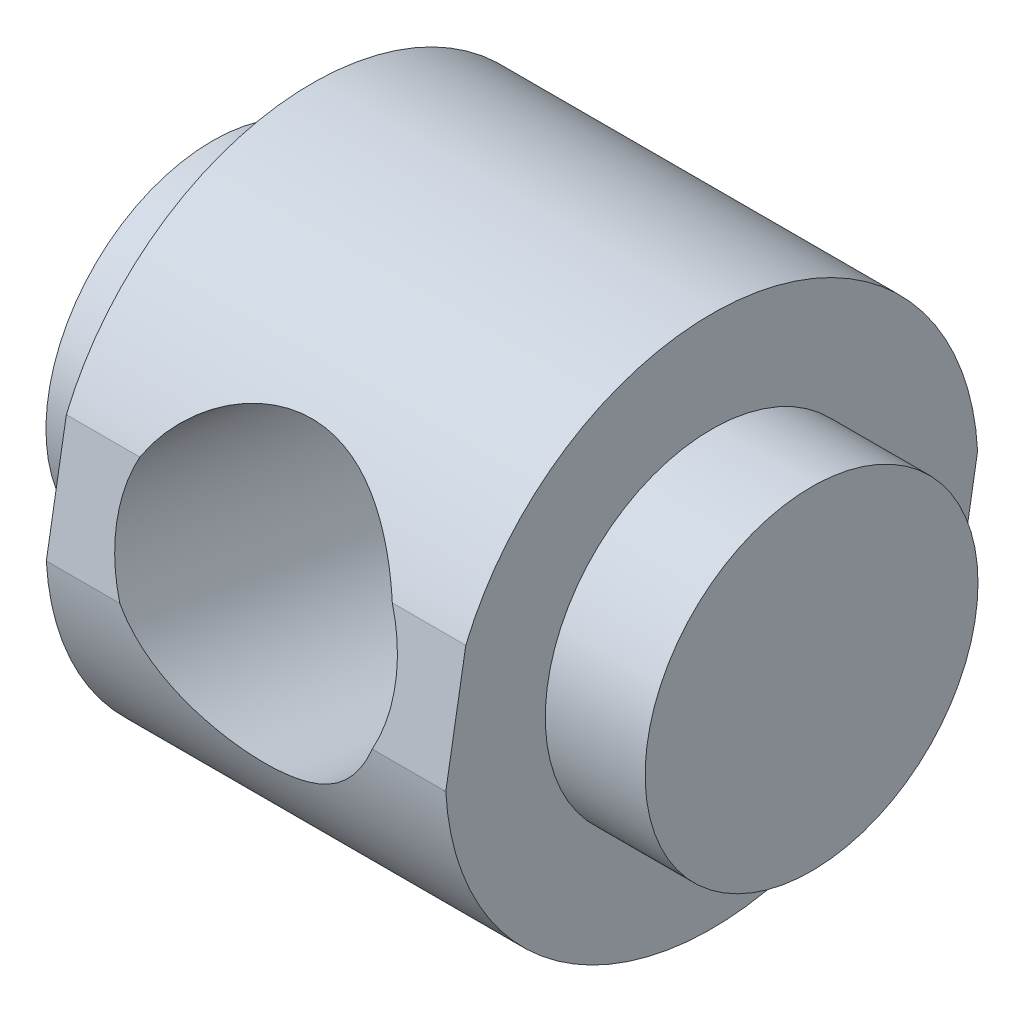
ISO-10303-21;
HEADER;
FILE_DESCRIPTION(('STEP AP214'),'2;1');
FILE_NAME('part.step','',(''),(''),'','','');
FILE_SCHEMA(('AUTOMOTIVE_DESIGN { 1 0 10303 214 1 1 1 1 }'));
ENDSEC;
DATA;
#1=APPLICATION_CONTEXT('core data for automotive mechanical design processes');
#2=APPLICATION_PROTOCOL_DEFINITION('international standard','automotive_design',2000,#1);
#3=PRODUCT_CONTEXT('',#1,'mechanical');
#4=PRODUCT('Part','Part','',(#3));
#5=PRODUCT_RELATED_PRODUCT_CATEGORY('part','',(#4));
#6=PRODUCT_DEFINITION_FORMATION('','',#4);
#7=PRODUCT_DEFINITION_CONTEXT('part definition',#1,'design');
#8=PRODUCT_DEFINITION('design','',#6,#7);
#9=PRODUCT_DEFINITION_SHAPE('','',#8);
#10=(LENGTH_UNIT() NAMED_UNIT(*) SI_UNIT(.MILLI.,.METRE.));
#11=(NAMED_UNIT(*) PLANE_ANGLE_UNIT() SI_UNIT($,.RADIAN.));
#12=(NAMED_UNIT(*) SI_UNIT($,.STERADIAN.) SOLID_ANGLE_UNIT());
#13=UNCERTAINTY_MEASURE_WITH_UNIT(LENGTH_MEASURE(1.E-05),#10,'distance_accuracy_value','');
#14=(GEOMETRIC_REPRESENTATION_CONTEXT(3) GLOBAL_UNCERTAINTY_ASSIGNED_CONTEXT((#13)) GLOBAL_UNIT_ASSIGNED_CONTEXT((#10,
#11,#12)) REPRESENTATION_CONTEXT('',''));
#15=CARTESIAN_POINT('',(0.,0.,0.));
#16=DIRECTION('',(0.,0.,1.));
#17=DIRECTION('',(1.,0.,0.));
#18=AXIS2_PLACEMENT_3D('',#15,#16,#17);
#19=CARTESIAN_POINT('',(9.5,28.9321861620804,8.96611499287433));
#20=DIRECTION('',(-1.,0.,0.));
#21=DIRECTION('',(0.,1.,0.));
#22=AXIS2_PLACEMENT_3D('',#19,#20,#21);
#23=PLANE('',#22);
#24=CARTESIAN_POINT('',(9.5,28.9321861620804,8.96611499287433));
#25=DIRECTION('',(-1.,0.,0.));
#26=DIRECTION('',(0.,-0.168953334472427,-0.985624051436778));
#27=AXIS2_PLACEMENT_3D('',#24,#25,#26);
#28=CIRCLE('',#27,5.);
#29=CARTESIAN_POINT('',(9.5,28.0874194897183,4.03799473569044));
#30=VERTEX_POINT('',#29);
#31=EDGE_CURVE('E11',#30,#30,#28,.T.);
#32=ORIENTED_EDGE('',*,*,#31,.T.);
#33=EDGE_LOOP('',(#32));
#34=FACE_BOUND('',#33,.T.);
#35=ADVANCED_FACE('F17',(#34),#23,.T.);
#36=CARTESIAN_POINT('',(27.5,28.9321861620804,8.96611499287432));
#37=DIRECTION('',(1.,0.,0.));
#38=DIRECTION('',(0.,0.,-1.));
#39=AXIS2_PLACEMENT_3D('',#36,#37,#38);
#40=PLANE('',#39);
#41=CARTESIAN_POINT('',(27.5,28.9321861620804,8.96611499287432));
#42=DIRECTION('',(1.,0.,0.));
#43=DIRECTION('',(0.,-0.985624051436778,0.168953334472427));
#44=AXIS2_PLACEMENT_3D('',#41,#42,#43);
#45=CIRCLE('',#44,5.);
#46=CARTESIAN_POINT('',(27.5,24.0040659048966,9.81088166523646));
#47=VERTEX_POINT('',#46);
#48=EDGE_CURVE('E25',#47,#47,#45,.T.);
#49=ORIENTED_EDGE('',*,*,#48,.T.);
#50=EDGE_LOOP('',(#49));
#51=FACE_BOUND('',#50,.T.);
#52=ADVANCED_FACE('F379',(#51),#40,.T.);
#53=CARTESIAN_POINT('',(12.5,28.9321861620804,8.96611499287433));
#54=DIRECTION('',(-1.,0.,0.));
#55=DIRECTION('',(0.,-0.168953334472427,-0.985624051436778));
#56=AXIS2_PLACEMENT_3D('',#53,#54,#55);
#57=CYLINDRICAL_SURFACE('',#56,5.);
#58=CARTESIAN_POINT('',(12.5,28.9321861620804,8.96611499287433));
#59=DIRECTION('',(-1.,0.,0.));
#60=DIRECTION('',(0.,-0.168953334472427,-0.985624051436778));
#61=AXIS2_PLACEMENT_3D('',#58,#59,#60);
#62=CIRCLE('',#61,5.);
#63=CARTESIAN_POINT('',(12.5,28.0874194897183,4.03799473569044));
#64=VERTEX_POINT('',#63);
#65=EDGE_CURVE('E168',#64,#64,#62,.T.);
#66=ORIENTED_EDGE('',*,*,#65,.T.);
#67=EDGE_LOOP('',(#66));
#68=FACE_BOUND('',#67,.T.);
#69=ORIENTED_EDGE('',*,*,#31,.F.);
#70=EDGE_LOOP('',(#69));
#71=FACE_BOUND('',#70,.T.);
#72=ADVANCED_FACE('F384',(#68,#71),#57,.T.);
#73=CARTESIAN_POINT('',(24.5,28.9321861620804,8.96611499287432));
#74=DIRECTION('',(1.,0.,0.));
#75=DIRECTION('',(0.,-0.985624051436778,0.168953334472427));
#76=AXIS2_PLACEMENT_3D('',#73,#74,#75);
#77=CYLINDRICAL_SURFACE('',#76,5.);
#78=ORIENTED_EDGE('',*,*,#48,.F.);
#79=EDGE_LOOP('',(#78));
#80=FACE_BOUND('',#79,.T.);
#81=CARTESIAN_POINT('',(24.5,28.9321861620804,8.96611499287432));
#82=DIRECTION('',(1.,0.,0.));
#83=DIRECTION('',(0.,-0.985624051436778,0.168953334472427));
#84=AXIS2_PLACEMENT_3D('',#81,#82,#83);
#85=CIRCLE('',#84,5.);
#86=CARTESIAN_POINT('',(24.5,24.0040659048966,9.81088166523646));
#87=VERTEX_POINT('',#86);
#88=EDGE_CURVE('E146',#87,#87,#85,.T.);
#89=ORIENTED_EDGE('',*,*,#88,.T.);
#90=EDGE_LOOP('',(#89));
#91=FACE_BOUND('',#90,.T.);
#92=ADVANCED_FACE('F389',(#80,#91),#77,.T.);
#93=CARTESIAN_POINT('',(29.5,32.475521573747,16.2724927710414));
#94=DIRECTION('',(0.,-0.168953334472427,-0.985624051436778));
#95=DIRECTION('',(0.,-0.985624051436778,0.168953334472427));
#96=AXIS2_PLACEMENT_3D('',#93,#94,#95);
#97=PLANE('',#96);
#98=DIRECTION('',(1.,0.,0.));
#99=VECTOR('',#98,1.);
#100=CARTESIAN_POINT('',(14.7078777016915,32.0021058092758,16.3536445772323));
#101=LINE('',#100,#99);
#102=CARTESIAN_POINT('',(12.5,32.0021058092758,16.3536445772323));
#103=VERTEX_POINT('',#102);
#104=CARTESIAN_POINT('',(14.7078777016899,32.0021058092753,16.3536445772324));
#105=VERTEX_POINT('',#104);
#106=EDGE_CURVE('E235',#103,#105,#101,.T.);
#107=ORIENTED_EDGE('',*,*,#106,.F.);
#108=DIRECTION('',(0.,0.985624051436778,-0.168953334472426));
#109=VECTOR('',#108,1.);
#110=CARTESIAN_POINT('',(12.5,32.0021058092758,16.3536445772323));
#111=LINE('',#110,#109);
#112=CARTESIAN_POINT('',(12.5,28.4979385326549,16.9543206109301));
#113=VERTEX_POINT('',#112);
#114=EDGE_CURVE('E166',#113,#103,#111,.T.);
#115=ORIENTED_EDGE('',*,*,#114,.F.);
#116=DIRECTION('',(-1.,0.,0.));
#117=VECTOR('',#116,1.);
#118=CARTESIAN_POINT('',(14.7078777016897,28.4979385326549,16.9543206109301));
#119=LINE('',#118,#117);
#120=CARTESIAN_POINT('',(14.7078777016915,28.4979385326549,16.9543206109301));
#121=VERTEX_POINT('',#120);
#122=EDGE_CURVE('E240',#121,#113,#119,.T.);
#123=ORIENTED_EDGE('',*,*,#122,.F.);
#124=CARTESIAN_POINT('',(18.5,30.2500221709654,16.6539825940812));
#125=DIRECTION('',(0.,0.168953334472427,0.985624051436778));
#126=DIRECTION('',(-1.,0.,0.));
#127=AXIS2_PLACEMENT_3D('',#124,#125,#126);
#128=CIRCLE('',#127,4.18810118375);
#129=CARTESIAN_POINT('',(14.31189881625,30.2500221709654,16.6539825940812));
#130=VERTEX_POINT('',#129);
#131=EDGE_CURVE('E179',#130,#121,#128,.T.);
#132=ORIENTED_EDGE('',*,*,#131,.F.);
#133=CARTESIAN_POINT('',(18.5,30.2500221709654,16.6539825940812));
#134=DIRECTION('',(0.,0.168953334472427,0.985624051436778));
#135=DIRECTION('',(-0.905451452085861,0.418347972371721,-0.0717122160309971));
#136=AXIS2_PLACEMENT_3D('',#133,#134,#135);
#137=CIRCLE('',#136,4.18810118375);
#138=EDGE_CURVE('E203',#105,#130,#137,.T.);
#139=ORIENTED_EDGE('',*,*,#138,.F.);
#140=EDGE_LOOP('',(#107,#115,#123,#132,#139));
#141=FACE_BOUND('',#140,.T.);
#142=ADVANCED_FACE('F358',(#141),#97,.F.);
#143=CARTESIAN_POINT('',(29.5,32.475521573747,16.2724927710414));
#144=DIRECTION('',(0.,-0.168953334472427,-0.985624051436778));
#145=DIRECTION('',(0.,-0.985624051436778,0.168953334472427));
#146=AXIS2_PLACEMENT_3D('',#143,#144,#145);
#147=PLANE('',#146);
#148=DIRECTION('',(1.,0.,0.));
#149=VECTOR('',#148,1.);
#150=CARTESIAN_POINT('',(24.5,32.0021058092758,16.3536445772323));
#151=LINE('',#150,#149);
#152=CARTESIAN_POINT('',(22.2921222983102,32.0021058092753,16.3536445772324));
#153=VERTEX_POINT('',#152);
#154=CARTESIAN_POINT('',(24.5,32.0021058092758,16.3536445772323));
#155=VERTEX_POINT('',#154);
#156=EDGE_CURVE('E123',#153,#155,#151,.T.);
#157=ORIENTED_EDGE('',*,*,#156,.F.);
#158=CARTESIAN_POINT('',(18.5,30.2500221709654,16.6539825940812));
#159=DIRECTION('',(0.,0.168953334472427,0.985624051436778));
#160=DIRECTION('',(0.905451452085523,-0.418347972372431,0.0717122160311186));
#161=AXIS2_PLACEMENT_3D('',#158,#159,#160);
#162=CIRCLE('',#161,4.18810118375);
#163=CARTESIAN_POINT('',(22.2921222983085,28.4979385326549,16.9543206109301));
#164=VERTEX_POINT('',#163);
#165=EDGE_CURVE('E178',#164,#153,#162,.T.);
#166=ORIENTED_EDGE('',*,*,#165,.F.);
#167=DIRECTION('',(-1.,0.,0.));
#168=VECTOR('',#167,1.);
#169=CARTESIAN_POINT('',(24.5,28.4979385326549,16.9543206109301));
#170=LINE('',#169,#168);
#171=CARTESIAN_POINT('',(24.5,28.4979385326549,16.9543206109301));
#172=VERTEX_POINT('',#171);
#173=EDGE_CURVE('E149',#172,#164,#170,.T.);
#174=ORIENTED_EDGE('',*,*,#173,.F.);
#175=DIRECTION('',(0.,-0.985624051436778,0.168953334472426));
#176=VECTOR('',#175,1.);
#177=CARTESIAN_POINT('',(24.5,32.0021058092758,16.3536445772323));
#178=LINE('',#177,#176);
#179=EDGE_CURVE('E142',#155,#172,#178,.T.);
#180=ORIENTED_EDGE('',*,*,#179,.F.);
#181=EDGE_LOOP('',(#157,#166,#174,#180));
#182=FACE_BOUND('',#181,.T.);
#183=ADVANCED_FACE('F148',(#182),#147,.F.);
#184=CARTESIAN_POINT('',(29.5,25.0141983364618,1.7239592418717));
#185=DIRECTION('',(0.,0.168953334472427,0.985624051436778));
#186=DIRECTION('',(1.,0.,0.));
#187=AXIS2_PLACEMENT_3D('',#184,#185,#186);
#188=PLANE('',#187);
#189=DIRECTION('',(1.,0.,0.));
#190=VECTOR('',#189,1.);
#191=CARTESIAN_POINT('',(14.7078777016915,25.862266514885,1.5785854085164));
#192=LINE('',#191,#190);
#193=CARTESIAN_POINT('',(12.5,25.862266514885,1.5785854085164));
#194=VERTEX_POINT('',#193);
#195=CARTESIAN_POINT('',(14.7078777016915,25.862266514885,1.5785854085164));
#196=VERTEX_POINT('',#195);
#197=EDGE_CURVE('E241',#194,#196,#192,.T.);
#198=ORIENTED_EDGE('',*,*,#197,.F.);
#199=DIRECTION('',(0.,-0.985624051436778,0.168953334472426));
#200=VECTOR('',#199,1.);
#201=CARTESIAN_POINT('',(12.5,25.862266514885,1.5785854085164));
#202=LINE('',#201,#200);
#203=CARTESIAN_POINT('',(12.5,29.366433791506,0.977909374818524));
#204=VERTEX_POINT('',#203);
#205=EDGE_CURVE('E161',#204,#194,#202,.T.);
#206=ORIENTED_EDGE('',*,*,#205,.F.);
#207=DIRECTION('',(-1.,0.,0.));
#208=VECTOR('',#207,1.);
#209=CARTESIAN_POINT('',(14.7078777016897,29.366433791506,0.977909374818519));
#210=LINE('',#209,#208);
#211=CARTESIAN_POINT('',(14.7078777016915,29.366433791506,0.977909374818525));
#212=VERTEX_POINT('',#211);
#213=EDGE_CURVE('E232',#212,#204,#210,.T.);
#214=ORIENTED_EDGE('',*,*,#213,.F.);
#215=CARTESIAN_POINT('',(18.5,27.6143501531955,1.27824739166746));
#216=DIRECTION('',(0.,-0.168953334472427,-0.985624051436778));
#217=DIRECTION('',(-0.905451452085743,0.418347972371969,-0.0717122160310395));
#218=AXIS2_PLACEMENT_3D('',#215,#216,#217);
#219=CIRCLE('',#218,4.18810118375);
#220=CARTESIAN_POINT('',(14.31189881625,27.6143501531955,1.27824739166746));
#221=VERTEX_POINT('',#220);
#222=EDGE_CURVE('E218',#221,#212,#219,.T.);
#223=ORIENTED_EDGE('',*,*,#222,.F.);
#224=CARTESIAN_POINT('',(18.5,27.6143501531955,1.27824739166746));
#225=DIRECTION('',(0.,-0.168953334472427,-0.985624051436778));
#226=DIRECTION('',(-1.,0.,0.));
#227=AXIS2_PLACEMENT_3D('',#224,#225,#226);
#228=CIRCLE('',#227,4.18810118375);
#229=EDGE_CURVE('E214',#196,#221,#228,.T.);
#230=ORIENTED_EDGE('',*,*,#229,.F.);
#231=EDGE_LOOP('',(#198,#206,#214,#223,#230));
#232=FACE_BOUND('',#231,.T.);
#233=ADVANCED_FACE('F351',(#232),#188,.F.);
#234=CARTESIAN_POINT('',(29.5,25.0141983364618,1.7239592418717));
#235=DIRECTION('',(0.,0.168953334472427,0.985624051436778));
#236=DIRECTION('',(1.,0.,0.));
#237=AXIS2_PLACEMENT_3D('',#234,#235,#236);
#238=PLANE('',#237);
#239=DIRECTION('',(1.,0.,0.));
#240=VECTOR('',#239,1.);
#241=CARTESIAN_POINT('',(24.5,25.862266514885,1.5785854085164));
#242=LINE('',#241,#240);
#243=CARTESIAN_POINT('',(22.2921222983085,25.8622665148851,1.57858540851639));
#244=VERTEX_POINT('',#243);
#245=CARTESIAN_POINT('',(24.5,25.862266514885,1.5785854085164));
#246=VERTEX_POINT('',#245);
#247=EDGE_CURVE('E244',#244,#246,#242,.T.);
#248=ORIENTED_EDGE('',*,*,#247,.F.);
#249=CARTESIAN_POINT('',(18.5,27.6143501531955,1.27824739166746));
#250=DIRECTION('',(0.,-0.168953334472427,-0.985624051436778));
#251=DIRECTION('',(0.905451452085743,-0.418347972371968,0.0717122160310392));
#252=AXIS2_PLACEMENT_3D('',#249,#250,#251);
#253=CIRCLE('',#252,4.18810118375);
#254=CARTESIAN_POINT('',(22.2921222983084,29.366433791506,0.977909374818522));
#255=VERTEX_POINT('',#254);
#256=EDGE_CURVE('E187',#255,#244,#253,.T.);
#257=ORIENTED_EDGE('',*,*,#256,.F.);
#258=DIRECTION('',(-1.,0.,0.));
#259=VECTOR('',#258,1.);
#260=CARTESIAN_POINT('',(24.5,29.366433791506,0.977909374818517));
#261=LINE('',#260,#259);
#262=CARTESIAN_POINT('',(24.5,29.366433791506,0.977909374818521));
#263=VERTEX_POINT('',#262);
#264=EDGE_CURVE('E135',#263,#255,#261,.T.);
#265=ORIENTED_EDGE('',*,*,#264,.F.);
#266=DIRECTION('',(0.,0.985624051436778,-0.168953334472426));
#267=VECTOR('',#266,1.);
#268=CARTESIAN_POINT('',(24.5,25.862266514885,1.57858540851639));
#269=LINE('',#268,#267);
#270=EDGE_CURVE('E144',#246,#263,#269,.T.);
#271=ORIENTED_EDGE('',*,*,#270,.F.);
#272=EDGE_LOOP('',(#248,#257,#265,#271));
#273=FACE_BOUND('',#272,.T.);
#274=ADVANCED_FACE('F366',(#273),#238,.F.);
#275=CARTESIAN_POINT('',(24.5,28.9321861620804,8.96611499287432));
#276=DIRECTION('',(-1.,0.,0.));
#277=DIRECTION('',(0.,-0.168953334472427,-0.985624051436778));
#278=AXIS2_PLACEMENT_3D('',#275,#276,#277);
#279=CYLINDRICAL_SURFACE('',#278,8.);
#280=ORIENTED_EDGE('',*,*,#173,.T.);
#281=CARTESIAN_POINT('',(22.292122298308,28.497938532654,16.9543206109303));
#282=CARTESIAN_POINT('',(22.2876123380333,28.488085585045,16.9537849954461));
#283=CARTESIAN_POINT('',(22.2771393895088,28.4654227697191,16.9525108887793));
#284=CARTESIAN_POINT('',(22.2590398116573,28.4270995589102,16.9501928893727));
#285=CARTESIAN_POINT('',(22.2316158854121,28.3705829974405,16.9464708979365));
#286=CARTESIAN_POINT('',(22.1891409486106,28.2865511162784,16.9402420261728));
#287=CARTESIAN_POINT('',(22.12154733313,28.1609012028978,16.9293040526781));
#288=CARTESIAN_POINT('',(22.0261985208725,27.9983671456936,16.9121376305382));
#289=CARTESIAN_POINT('',(21.9095004020778,27.8194278057749,16.8890611118427));
#290=CARTESIAN_POINT('',(21.7887926798963,27.6527540756867,16.8636563683043));
#291=CARTESIAN_POINT('',(21.6769171548586,27.511404558205,16.8392926598684));
#292=CARTESIAN_POINT('',(21.5749264013378,27.3917778449349,16.8166842271943));
#293=CARTESIAN_POINT('',(21.4787415764237,27.2862368990435,16.7951837141546));
#294=CARTESIAN_POINT('',(21.3829536873077,27.1873866850199,16.7737315635509));
#295=CARTESIAN_POINT('',(21.2834581254972,27.0907512277138,16.751516309219));
#296=CARTESIAN_POINT('',(21.1755165767504,26.9924504326604,16.7276153566872));
#297=CARTESIAN_POINT('',(21.0646677254679,26.8981814369252,16.7034176557624));
#298=CARTESIAN_POINT('',(20.9484479981239,26.8058177467989,16.67853427773));
#299=CARTESIAN_POINT('',(20.8089513826554,26.7024160587144,16.649388556647));
#300=CARTESIAN_POINT('',(20.6400255724902,26.5884873031557,16.6154643694124));
#301=CARTESIAN_POINT('',(20.444565327339,26.4714151263849,16.5785509615268));
#302=CARTESIAN_POINT('',(20.2626647558512,26.375466899239,16.5467437385581));
#303=CARTESIAN_POINT('',(20.0985901171304,26.2985682236625,16.5202926378776));
#304=CARTESIAN_POINT('',(19.9573730748517,26.2389325793304,16.4992108171571));
#305=CARTESIAN_POINT('',(19.8209255864497,26.1871356192335,16.4804721293177));
#306=CARTESIAN_POINT('',(19.6895672930377,26.1425036570194,16.4640031384101));
#307=CARTESIAN_POINT('',(19.5611857332768,26.1037302034302,16.4494514372464));
#308=CARTESIAN_POINT('',(19.4289308930178,26.0685247197209,16.4360463470439));
#309=CARTESIAN_POINT('',(19.2934987444319,26.0375476622598,16.4240903286885));
#310=CARTESIAN_POINT('',(19.1568110154099,26.0115280840516,16.4139303926631));
#311=CARTESIAN_POINT('',(19.0351437965676,25.9927042968815,16.4065141334428));
#312=CARTESIAN_POINT('',(18.925393631852,25.97905095221,16.4011025584242));
#313=CARTESIAN_POINT('',(18.8241582991481,25.9691319191447,16.3971538194209));
#314=CARTESIAN_POINT('',(18.721304173669,25.9618085254929,16.3942284881207));
#315=CARTESIAN_POINT('',(18.6130114377546,25.9570311058404,16.3923156588918));
#316=CARTESIAN_POINT('',(18.5389388969352,25.9559003421075,16.3918622763039));
#317=CARTESIAN_POINT('',(18.4561401700963,25.9559060355622,16.3918645583379));
#318=CARTESIAN_POINT('',(18.3492435540797,25.9577356797068,16.3925980948763));
#319=CARTESIAN_POINT('',(18.1798926189943,25.9676954818997,16.3965850434258));
#320=CARTESIAN_POINT('',(17.9925343136613,25.9879731361157,16.4046525486981));
#321=CARTESIAN_POINT('',(17.8237999763116,26.0145669721521,16.4151303396085));
#322=CARTESIAN_POINT('',(17.6739985107021,26.0446048709788,16.42682516347));
#323=CARTESIAN_POINT('',(17.5397014462844,26.0764136147137,16.4390667987327));
#324=CARTESIAN_POINT('',(17.4014628223846,26.1143389700928,16.4534639445781));
#325=CARTESIAN_POINT('',(17.2383466179114,26.1656944367825,16.4726343476549));
#326=CARTESIAN_POINT('',(17.0576891937398,26.2319175502951,16.496776107665));
#327=CARTESIAN_POINT('',(16.8675962957096,26.3131247436518,16.5254231300258));
#328=CARTESIAN_POINT('',(16.7105468199233,26.3895401480924,16.5514276716032));
#329=CARTESIAN_POINT('',(16.584719199962,26.4568271838868,16.5735957953058));
#330=CARTESIAN_POINT('',(16.4884128050973,26.5118164420669,16.5912620388429));
#331=CARTESIAN_POINT('',(16.3993520069663,26.5656774413934,16.6081479740157));
#332=CARTESIAN_POINT('',(16.3141536277989,26.6200096418263,16.6247674769886));
#333=CARTESIAN_POINT('',(16.229781854726,26.6766777341597,16.6416537840557));
#334=CARTESIAN_POINT('',(16.1364157752906,26.7426642147921,16.6607759940414));
#335=CARTESIAN_POINT('',(16.0345274228799,26.8190343077772,16.6821512827566));
#336=CARTESIAN_POINT('',(15.9247284773551,26.9069877637843,16.7057192636644));
#337=CARTESIAN_POINT('',(15.8254218816694,26.9919514783252,16.7274269422256));
#338=CARTESIAN_POINT('',(15.7363041250404,27.0727116576869,16.7471367446342));
#339=CARTESIAN_POINT('',(15.6568925044122,27.1483244111113,16.7648269964099));
#340=CARTESIAN_POINT('',(15.5788063880679,27.2264491393972,16.7822947212212));
#341=CARTESIAN_POINT('',(15.5020781969064,27.3071301222091,16.7994747048458));
#342=CARTESIAN_POINT('',(15.42701540604,27.3901081372243,16.8162389154887));
#343=CARTESIAN_POINT('',(15.3538106388085,27.4752096779451,16.8324847848789));
#344=CARTESIAN_POINT('',(15.2826833881522,27.562192390296,16.8481052225261));
#345=CARTESIAN_POINT('',(15.2137999698915,27.6508467961205,16.8630072347612));
#346=CARTESIAN_POINT('',(15.1472688721305,27.7410056481816,16.8771137556019));
#347=CARTESIAN_POINT('',(15.0832763075178,27.8323674096059,16.8903355624785));
#348=CARTESIAN_POINT('',(15.0218543278782,27.9248144579411,16.9026207912262));
#349=CARTESIAN_POINT('',(14.963117877779,28.0180846502237,16.9139061017882));
#350=CARTESIAN_POINT('',(14.906953606543,28.1122660500268,16.9241764972224));
#351=CARTESIAN_POINT('',(14.853371049209,28.2072656361966,16.9333952316278));
#352=CARTESIAN_POINT('',(14.8022509023834,28.3032368004548,16.9415484294637));
#353=CARTESIAN_POINT('',(14.7536575365269,28.4000098931356,16.9485928222075));
#354=CARTESIAN_POINT('',(14.7228473952259,28.4652341985173,16.9525428630035));
#355=CARTESIAN_POINT('',(14.7078777016915,28.4979385326549,16.9543206109301));
#356=(BOUNDED_CURVE() B_SPLINE_CURVE(3,(#281,#282,#283,#284,#285,#286,#287,#288,#289,#290,#291,
#292,#293,#294,#295,#296,#297,#298,#299,#300,#301,#302,#303,#304,#305,#306,#307,#308,#309,#310,
#311,#312,#313,#314,#315,#316,#317,#318,#319,#320,#321,#322,#323,#324,#325,#326,#327,#328,#329,
#330,#331,#332,#333,#334,#335,#336,#337,#338,#339,#340,#341,#342,#343,#344,#345,#346,#347,#348,
#349,#350,#351,#352,#353,#354,#355),.UNSPECIFIED.,.F.,.F.) B_SPLINE_CURVE_WITH_KNOTS((4,1,1,1,1,
1,1,1,1,1,1,1,1,1,1,1,1,1,1,1,1,1,1,1,1,1,1,1,1,1,1,1,1,1,1,1,1,1,1,1,1,1,1,1,1,1,1,1,1,1,1,1,1,
1,1,1,1,1,1,1,1,1,1,1,1,1,1,1,1,1,1,1,4),(-1.,-0.996651289687855,-0.992283938378942,
-0.986897693443876,-0.97722492417873,-0.963152721102108,-0.942721727736752,-0.918819593456926,
-0.896831367431257,-0.878710267159151,-0.862661023267596,-0.847799575195839,-0.834128741396208,
-0.819651488285885,-0.804432371541542,-0.78845611707767,-0.77411179030148,-0.75796155320728,
-0.734099486660581,-0.710352749677999,-0.686715882226512,-0.669871689432698,-0.653824547362671,
-0.638948332384977,-0.624443266152868,-0.610690972378039,-0.597301005784033,-0.581993215158953,
-0.567650793720344,-0.554238856664895,-0.543919470644097,-0.533464920510984,-0.522809578604237,
-0.512070678277628,-0.49999412847409,-0.499939719596079,-0.486507088771083,-0.466991057737586,
-0.447571385397513,-0.428297798309624,-0.414167939356267,-0.400264869105048,-0.385522119551643,
-0.369694284272437,-0.347150976524436,-0.325676706671645,-0.305273269566202,-0.292644261926177,
-0.281098042946922,-0.270605159753166,-0.260090976066556,-0.249478802162158,-0.238791956252602,
-0.224297615040081,-0.209614115473087,-0.194752911749389,-0.183397872796119,-0.171990104830281,
-0.160464604624944,-0.148874832574196,-0.137210913598943,-0.125534866260565,-0.113855278671755,
-0.102183377177187,-0.0905623939711749,-0.0789793106065319,-0.0674934681499495,
-0.0560741293064908,-0.0447605074266884,-0.0334827710903645,-0.0222789134646092,
-0.0111027051913207,0.),
.UNSPECIFIED.) CURVE() GEOMETRIC_REPRESENTATION_ITEM() RATIONAL_B_SPLINE_CURVE((1.,1.,1.,1.,1.,
1.,1.,1.,1.,1.,1.,1.,1.,1.,1.,1.,1.,1.,1.,1.,1.,1.,1.,1.,1.,1.,1.,1.,1.,1.,1.,1.,1.,1.,1.,1.,1.,
1.,1.,1.,1.,1.,1.,1.,1.,1.,1.,1.,1.,1.,1.,1.,1.,1.,1.,1.,1.,1.,1.,1.,1.,1.,1.,1.,1.,1.,1.,1.,1.,
1.,1.,1.,1.,1.,1.)) REPRESENTATION_ITEM(''));
#357=EDGE_CURVE('E172',#164,#121,#356,.T.);
#358=ORIENTED_EDGE('',*,*,#357,.T.);
#359=ORIENTED_EDGE('',*,*,#122,.T.);
#360=CARTESIAN_POINT('',(12.5,28.9321861620804,8.96611499287433));
#361=DIRECTION('',(-1.,0.,0.));
#362=DIRECTION('',(0.,-0.383739955899426,-0.923441198044741));
#363=AXIS2_PLACEMENT_3D('',#360,#361,#362);
#364=CIRCLE('',#363,8.);
#365=EDGE_CURVE('E171',#194,#113,#364,.T.);
#366=ORIENTED_EDGE('',*,*,#365,.F.);
#367=ORIENTED_EDGE('',*,*,#197,.T.);
#368=CARTESIAN_POINT('',(14.7078777016915,25.862266514885,1.5785854085164));
#369=CARTESIAN_POINT('',(14.7123876560201,25.8531544747859,1.58237195422786));
#370=CARTESIAN_POINT('',(14.7228605935104,25.8322098516803,1.59112113901702));
#371=CARTESIAN_POINT('',(14.7409601493182,25.7968465793847,1.60607028957643));
#372=CARTESIAN_POINT('',(14.7683840037184,25.7447963128792,1.62840251407588));
#373=CARTESIAN_POINT('',(14.8108587444068,25.6676367035698,1.66226235214321));
#374=CARTESIAN_POINT('',(14.8748289869357,25.5589587566733,1.71162734840627));
#375=CARTESIAN_POINT('',(14.958400481732,25.4288262607991,1.77344461231986));
#376=CARTESIAN_POINT('',(15.0532013331392,25.2948558599737,1.84030426360926));
#377=CARTESIAN_POINT('',(15.14954088451,25.1706402099788,1.90519970023852));
#378=CARTESIAN_POINT('',(15.2489532134183,25.0524235609935,1.96945150726045));
#379=CARTESIAN_POINT('',(15.3550198152673,24.9362068775399,2.03513551215372));
#380=CARTESIAN_POINT('',(15.4711541310432,24.8195016511895,2.10377451041595));
#381=CARTESIAN_POINT('',(15.5801858198995,24.7189084495521,2.1652102602392));
#382=CARTESIAN_POINT('',(15.6788789905051,24.6342341639537,2.21851882939145));
#383=CARTESIAN_POINT('',(15.7649689590891,24.5645768714481,2.26342106736298));
#384=CARTESIAN_POINT('',(15.8512780568904,24.4985653840359,2.30690985340866));
#385=CARTESIAN_POINT('',(15.9448438189455,24.4309542498433,2.35239923971631));
#386=CARTESIAN_POINT('',(16.051537277852,24.3586095435693,2.40217934990299));
#387=CARTESIAN_POINT('',(16.1910387115443,24.2708143559006,2.46410141635706));
#388=CARTESIAN_POINT('',(16.359968554799,24.1746854831553,2.53403462978775));
#389=CARTESIAN_POINT('',(16.5554330007346,24.0765886721158,2.60783310153137));
#390=CARTESIAN_POINT('',(16.7373351386019,23.9967108457685,2.66978042624837));
#391=CARTESIAN_POINT('',(16.9014098275488,23.9330118458116,2.72033245682771));
#392=CARTESIAN_POINT('',(17.0426266211566,23.8838021841381,2.76007223056494));
#393=CARTESIAN_POINT('',(17.1790739909114,23.8412032586646,2.7949920209617));
#394=CARTESIAN_POINT('',(17.3104323075931,23.8046043145317,2.82538543358976));
#395=CARTESIAN_POINT('',(17.4388139884524,23.7728908425747,2.85201986296207));
#396=CARTESIAN_POINT('',(17.5710690125274,23.7441597617304,2.87638483769159));
#397=CARTESIAN_POINT('',(17.7065013098369,23.7189331101834,2.89797518139701));
#398=CARTESIAN_POINT('',(17.843189130982,23.697782747235,2.91622088398824));
#399=CARTESIAN_POINT('',(17.9648563603342,23.6825035992773,2.92948298516563));
#400=CARTESIAN_POINT('',(18.074606487618,23.6714320568077,2.93913283665045));
#401=CARTESIAN_POINT('',(18.1758417752382,23.6633944348783,2.94615965885804));
#402=CARTESIAN_POINT('',(18.2786958606238,23.6574634190553,2.95135702713694));
#403=CARTESIAN_POINT('',(18.3869885737031,23.6535958113629,2.95475176562357));
#404=CARTESIAN_POINT('',(18.4610610956616,23.6526806023019,2.95555586382516));
#405=CARTESIAN_POINT('',(18.5438598211381,23.6526852105263,2.95555181601363));
#406=CARTESIAN_POINT('',(18.6507564365659,23.6541660956296,2.95425079659123));
#407=CARTESIAN_POINT('',(18.8201073560485,23.6622294381091,2.94717436412013));
#408=CARTESIAN_POINT('',(19.007465617446,23.6786625523032,2.93281398985942));
#409=CARTESIAN_POINT('',(19.1761999071363,23.7002485074294,2.91407734007396));
#410=CARTESIAN_POINT('',(19.3260013194125,23.7246765667495,2.89304610011043));
#411=CARTESIAN_POINT('',(19.4602983853957,23.7505922653117,2.87090948159963));
#412=CARTESIAN_POINT('',(19.5985371328864,23.7815575128611,2.84470325714527));
#413=CARTESIAN_POINT('',(19.7613994634348,23.8235309632863,2.80957816771924));
#414=CARTESIAN_POINT('',(19.9413142930288,23.8776922424665,2.76495615445629));
#415=CARTESIAN_POINT('',(20.1299742639216,23.9441425323581,2.71135795461875));
#416=CARTESIAN_POINT('',(20.2849454911644,24.0065518418375,2.66214262520942));
#417=CARTESIAN_POINT('',(20.4080728058512,24.0612003964698,2.6198888441017));
#418=CARTESIAN_POINT('',(20.5009411021675,24.1052696958089,2.58631587903502));
#419=CARTESIAN_POINT('',(20.5859884705817,24.1480446397683,2.55418054347845));
#420=CARTESIAN_POINT('',(20.669765474144,24.1924887613518,2.52124408251774));
#421=CARTESIAN_POINT('',(20.7584828035639,24.2422157374304,2.48494016837786));
#422=CARTESIAN_POINT('',(20.8675051649997,24.3070854499586,2.43839483971114));
#423=CARTESIAN_POINT('',(20.9930428389234,24.3876939014666,2.38190034547227));
#424=CARTESIAN_POINT('',(21.1310234584774,24.4845985680753,2.31601483344388));
#425=CARTESIAN_POINT('',(21.2527357583751,24.5780570212535,2.25451636451133));
#426=CARTESIAN_POINT('',(21.3564473171119,24.6639814782401,2.19964530874354));
#427=CARTESIAN_POINT('',(21.4409661155662,24.7383746960856,2.15330501942779));
#428=CARTESIAN_POINT('',(21.5194640747289,24.811460142085,2.10885641035748));
#429=CARTESIAN_POINT('',(21.5946665238278,24.8853931154169,2.0649549873324));
#430=CARTESIAN_POINT('',(21.6686162380371,24.9622316050775,2.02045580983221));
#431=CARTESIAN_POINT('',(21.7412457154095,25.0420845334703,1.97540740743128));
#432=CARTESIAN_POINT('',(21.8120536811286,25.1245524975333,1.93013948598033));
#433=CARTESIAN_POINT('',(21.8807782934548,25.2094341509143,1.88485371227572));
#434=CARTESIAN_POINT('',(21.9471693792888,25.2964849038628,1.83975969064141));
#435=CARTESIAN_POINT('',(22.0111765966725,25.3856964415291,1.79493711907059));
#436=CARTESIAN_POINT('',(22.0727101154829,25.4770036399007,1.75049249551226));
#437=CARTESIAN_POINT('',(22.1316911761586,25.5703468662293,1.70652554545895));
#438=CARTESIAN_POINT('',(22.1880623784142,25.6656929543201,1.66312005004513));
#439=CARTESIAN_POINT('',(22.2417130461272,25.7629148150348,1.62040005953795));
#440=CARTESIAN_POINT('',(22.2756450085126,25.8289753955687,1.59241952691004));
#441=CARTESIAN_POINT('',(22.2921222983085,25.8622665148851,1.57858540851639));
#442=(BOUNDED_CURVE() B_SPLINE_CURVE(3,(#368,#369,#370,#371,#372,#373,#374,#375,#376,#377,#378,
#379,#380,#381,#382,#383,#384,#385,#386,#387,#388,#389,#390,#391,#392,#393,#394,#395,#396,#397,
#398,#399,#400,#401,#402,#403,#404,#405,#406,#407,#408,#409,#410,#411,#412,#413,#414,#415,#416,
#417,#418,#419,#420,#421,#422,#423,#424,#425,#426,#427,#428,#429,#430,#431,#432,#433,#434,#435,
#436,#437,#438,#439,#440,#441),.UNSPECIFIED.,.F.,.F.) B_SPLINE_CURVE_WITH_KNOTS((4,1,1,1,1,1,1,
1,1,1,1,1,1,1,1,1,1,1,1,1,1,1,1,1,1,1,1,1,1,1,1,1,1,1,1,1,1,1,1,1,1,1,1,1,1,1,1,1,1,1,1,1,1,1,1,
1,1,1,1,1,1,1,1,1,1,1,1,1,1,1,1,4),(-1.,-0.996651300532443,-0.992283957939504,
-0.986897717777545,-0.977224977594148,-0.963152856660309,-0.945089763737197,-0.925812109400783,
-0.908449550757152,-0.892586329607671,-0.874163611928066,-0.855814151254206,-0.837521126278301,
-0.824595785355943,-0.812422727380345,-0.800625869370248,-0.788459675332485,-0.774114083452231,
-0.757962663211816,-0.734099693144713,-0.710352666103852,-0.686715843067033,-0.669871750544276,
-0.653824660248735,-0.638948445196973,-0.62444334887188,-0.610691008682451,-0.597301002438187,
-0.581993187064367,-0.567650759245736,-0.554238828756274,-0.543919451793267,-0.533464911160019,
-0.522809577077661,-0.51207068175644,-0.499994131015618,-0.49993972408836,-0.486507091655269,
-0.466991057387523,-0.447571386565917,-0.428297809139056,-0.414167963934826,-0.400264908852294,
-0.385522157907001,-0.369694298389227,-0.347233695562648,-0.325924885800696,-0.305769820379435,
-0.293471869531468,-0.282339836756429,-0.272385929883594,-0.262451687857608,-0.251342529558685,
-0.23904220800928,-0.220727428286699,-0.202092299344314,-0.183159275394616,-0.169696464963357,
-0.157196896559162,-0.145570381596662,-0.133852965752583,-0.121928267203375,-0.109890851120395,
-0.097735135432584,-0.0855669193158337,-0.0733769063620551,-0.0611674569851032,
-0.0489404699934058,-0.0367092899923355,-0.0244722045528509,-0.0122195039581353,0.),
.UNSPECIFIED.) CURVE() GEOMETRIC_REPRESENTATION_ITEM() RATIONAL_B_SPLINE_CURVE((1.,1.,1.,1.,1.,
1.,1.,1.,1.,1.,1.,1.,1.,1.,1.,1.,1.,1.,1.,1.,1.,1.,1.,1.,1.,1.,1.,1.,1.,1.,1.,1.,1.,1.,1.,1.,1.,
1.,1.,1.,1.,1.,1.,1.,1.,1.,1.,1.,1.,1.,1.,1.,1.,1.,1.,1.,1.,1.,1.,1.,1.,1.,1.,1.,1.,1.,1.,1.,1.,
1.,1.,1.,1.,1.)) REPRESENTATION_ITEM(''));
#443=EDGE_CURVE('E190',#196,#244,#442,.T.);
#444=ORIENTED_EDGE('',*,*,#443,.T.);
#445=ORIENTED_EDGE('',*,*,#247,.T.);
#446=CARTESIAN_POINT('',(24.5,28.9321861620804,8.96611499287432));
#447=DIRECTION('',(-1.,0.,0.));
#448=DIRECTION('',(0.,-0.383739955899426,-0.923441198044741));
#449=AXIS2_PLACEMENT_3D('',#446,#447,#448);
#450=CIRCLE('',#449,8.);
#451=EDGE_CURVE('E152',#246,#172,#450,.T.);
#452=ORIENTED_EDGE('',*,*,#451,.T.);
#453=EDGE_LOOP('',(#280,#358,#359,#366,#367,#444,#445,#452));
#454=FACE_BOUND('',#453,.T.);
#455=ADVANCED_FACE('F355',(#454),#279,.T.);
#456=CARTESIAN_POINT('',(24.5,28.9321861620804,8.96611499287432));
#457=DIRECTION('',(-1.,0.,0.));
#458=DIRECTION('',(0.,-0.168953334472427,-0.985624051436778));
#459=AXIS2_PLACEMENT_3D('',#456,#457,#458);
#460=CYLINDRICAL_SURFACE('',#459,8.);
#461=ORIENTED_EDGE('',*,*,#156,.T.);
#462=CARTESIAN_POINT('',(24.5,28.9321861620804,8.96611499287432));
#463=DIRECTION('',(-1.,0.,0.));
#464=DIRECTION('',(0.,0.383739955899423,0.923441198044742));
#465=AXIS2_PLACEMENT_3D('',#462,#463,#464);
#466=CIRCLE('',#465,8.);
#467=EDGE_CURVE('E126',#155,#263,#466,.T.);
#468=ORIENTED_EDGE('',*,*,#467,.T.);
#469=ORIENTED_EDGE('',*,*,#264,.T.);
#470=CARTESIAN_POINT('',(22.292122298308,29.366433791507,0.977909374818352));
#471=CARTESIAN_POINT('',(22.2814090885742,29.3898390610455,0.979181653401322));
#472=CARTESIAN_POINT('',(22.2551960264349,29.4458272643574,0.982473174019128));
#473=CARTESIAN_POINT('',(22.2056132775623,29.5462783699849,0.989436612512536));
#474=CARTESIAN_POINT('',(22.1350137942079,29.6795193473735,1.00061586039954));
#475=CARTESIAN_POINT('',(22.035511653357,29.8511669299948,1.01830132642538));
#476=CARTESIAN_POINT('',(21.9105771970032,30.0441842874953,1.04287944758182));
#477=CARTESIAN_POINT('',(21.7702089847546,30.2370248019104,1.07251003241265));
#478=CARTESIAN_POINT('',(21.6305506582168,30.4095183525404,1.10314178130248));
#479=CARTESIAN_POINT('',(21.4968723998952,30.5597047753803,1.13297795217357));
#480=CARTESIAN_POINT('',(21.3698543591475,30.6906617811999,1.1614397756251));
#481=CARTESIAN_POINT('',(21.2486538025373,30.8062708639424,1.18845845953161));
#482=CARTESIAN_POINT('',(21.1246488884149,30.916270070314,1.21578596089619));
#483=CARTESIAN_POINT('',(20.9877182796859,31.0287431405291,1.24540987294246));
#484=CARTESIAN_POINT('',(20.8413850508796,31.138735859192,1.27616268017033));
#485=CARTESIAN_POINT('',(20.6915530723207,31.2415496994654,1.30647138342856));
#486=CARTESIAN_POINT('',(20.5450874412915,31.3335197170685,1.33483211603551));
#487=CARTESIAN_POINT('',(20.3958119674343,31.4189573547656,1.3622703836328));
#488=CARTESIAN_POINT('',(20.2463145374131,31.4965582027318,1.38811956797063));
#489=CARTESIAN_POINT('',(20.0989199608359,31.565662810348,1.41188755272021));
#490=CARTESIAN_POINT('',(19.9574584513269,31.6254072925168,1.43300743023146));
#491=CARTESIAN_POINT('',(19.8209274842077,31.6772360248086,1.45175760795566));
#492=CARTESIAN_POINT('',(19.6895685279908,31.7218682840856,1.46822670384318));
#493=CARTESIAN_POINT('',(19.5611856169827,31.7606421748429,1.48277856826206));
#494=CARTESIAN_POINT('',(19.4291598831957,31.7957866363492,1.49616042384539));
#495=CARTESIAN_POINT('',(19.2944292000667,31.8266160578181,1.50805899066057));
#496=CARTESIAN_POINT('',(19.1591655834033,31.852415944028,1.51813191980358));
#497=CARTESIAN_POINT('',(19.0359719384181,31.8715809443545,1.52568098924237));
#498=CARTESIAN_POINT('',(18.9179973967501,31.8862629659905,1.53150061083906));
#499=CARTESIAN_POINT('',(18.7836443927504,31.8989584635197,1.53655808320636));
#500=CARTESIAN_POINT('',(18.6429250362562,31.9068128740168,1.53970257027889));
#501=CARTESIAN_POINT('',(18.5253589081251,31.9087441923269,1.5404768097062));
#502=CARTESIAN_POINT('',(18.407754196113,31.907976230392,1.54016904310194));
#503=CARTESIAN_POINT('',(18.292247367072,31.9038164555847,1.53850143721668));
#504=CARTESIAN_POINT('',(18.1577986864769,31.8937815168959,1.53449379302022));
#505=CARTESIAN_POINT('',(18.0506218137456,31.8825867081818,1.5300413005684));
#506=CARTESIAN_POINT('',(17.9523153291527,31.8696991555832,1.52493988551108));
#507=CARTESIAN_POINT('',(17.8596551676753,31.8552407599879,1.51924694746264));
#508=CARTESIAN_POINT('',(17.7689101336245,31.8388458226094,1.51283088604333));
#509=CARTESIAN_POINT('',(17.6806375414791,31.8207565413225,1.50580010688569));
#510=CARTESIAN_POINT('',(17.5944189387296,31.8010305992852,1.49819081103441));
#511=CARTESIAN_POINT('',(17.4958230190093,31.7761505805921,1.48867162085111));
#512=CARTESIAN_POINT('',(17.3686075255649,31.7402964636083,1.47510292963675));
#513=CARTESIAN_POINT('',(17.2096115122055,31.6887159307814,1.45592495872795));
#514=CARTESIAN_POINT('',(17.0437964286592,31.6263018598453,1.43329439258943));
#515=CARTESIAN_POINT('',(16.8957689281324,31.5631156490903,1.41101378006285));
#516=CARTESIAN_POINT('',(16.7665153052047,31.5024251713712,1.39015573907313));
#517=CARTESIAN_POINT('',(16.6292412391805,31.4324416647805,1.36670980926383));
#518=CARTESIAN_POINT('',(16.4611842001414,31.338153095044,1.33617844772625));
#519=CARTESIAN_POINT('',(16.2608046025614,31.2115258429264,1.29720679092619));
#520=CARTESIAN_POINT('',(16.0652200241838,31.0707191573334,1.25674900559554));
#521=CARTESIAN_POINT('',(15.9054192929142,30.9418049421819,1.22234723967667));
#522=CARTESIAN_POINT('',(15.7912966066909,30.8420742821291,1.19728021891994));
#523=CARTESIAN_POINT('',(15.7017349527631,30.7592477495109,1.17740643108511));
#524=CARTESIAN_POINT('',(15.6074895920013,30.6675156044364,1.15636337766876));
#525=CARTESIAN_POINT('',(15.5024606194449,30.5585223347191,1.13283177309175));
#526=CARTESIAN_POINT('',(15.3900592828826,30.4327447474385,1.10774417127636));
#527=CARTESIAN_POINT('',(15.2864295268723,30.307629410283,1.0849030375469));
#528=CARTESIAN_POINT('',(15.1932588585329,30.1866947500719,1.06479916708926));
#529=CARTESIAN_POINT('',(15.1118418523657,30.0737380090118,1.04771981302231));
#530=CARTESIAN_POINT('',(15.0435670069647,29.9728418728361,1.03389640325179));
#531=CARTESIAN_POINT('',(14.9853852091782,29.8820556404937,1.02256144129635));
#532=CARTESIAN_POINT('',(14.9346560288886,29.7990271378376,1.01306860858122));
#533=CARTESIAN_POINT('',(14.8856395416639,29.7147775206225,1.00433288385208));
#534=CARTESIAN_POINT('',(14.8383660794813,29.6293317973094,0.996392727495368));
#535=CARTESIAN_POINT('',(14.7928805342594,29.54274292852,0.989288082911619));
#536=CARTESIAN_POINT('',(14.7492660867225,29.4551432128447,0.983063374565737));
#537=CARTESIAN_POINT('',(14.7214484258031,29.3960818207379,0.979521007243567));
#538=CARTESIAN_POINT('',(14.7078777016915,29.366433791506,0.977909374818525));
#539=(BOUNDED_CURVE() B_SPLINE_CURVE(3,(#470,#471,#472,#473,#474,#475,#476,#477,#478,#479,#480,
#481,#482,#483,#484,#485,#486,#487,#488,#489,#490,#491,#492,#493,#494,#495,#496,#497,#498,#499,
#500,#501,#502,#503,#504,#505,#506,#507,#508,#509,#510,#511,#512,#513,#514,#515,#516,#517,#518,
#519,#520,#521,#522,#523,#524,#525,#526,#527,#528,#529,#530,#531,#532,#533,#534,#535,#536,#537,
#538),.UNSPECIFIED.,.F.,.F.) B_SPLINE_CURVE_WITH_KNOTS((4,1,1,1,1,1,1,1,1,1,1,1,1,1,1,1,1,1,1,1,
1,1,1,1,1,1,1,1,1,1,1,1,1,1,1,1,1,1,1,1,1,1,1,1,1,1,1,1,1,1,1,1,1,1,1,1,1,1,1,1,1,1,1,1,1,1,4),
(-1.,-0.992044901569011,-0.980890212198014,-0.965352166702821,-0.945368627372664,
-0.91940871510271,-0.893988441870035,-0.871180763557795,-0.850251567636312,-0.831244298485229,
-0.814179088948441,-0.797871995175943,-0.779376991776476,-0.758714809953247,-0.740568585916144,
-0.722502161412001,-0.70460948806619,-0.686799430588,-0.669899806792014,-0.653825008142171,
-0.638948830053262,-0.624443663848525,-0.610691086111968,-0.597300728914668,-0.582066590649807,
-0.567872152449972,-0.554683342729857,-0.543509358672649,-0.531125270013074,-0.512990959806025,
-0.499994481360128,-0.494827200174848,-0.476682006533439,-0.464318354659463,-0.453192216986369,
-0.443389546359293,-0.433670133289006,-0.42418511424371,-0.414849743024416,-0.40576540772824,
-0.396777735994421,-0.383319852999763,-0.364751876857349,-0.34484728891899,-0.328184627053545,
-0.314590914674094,-0.300295978436755,-0.280069134528201,-0.254367609176901,-0.226153656719183,
-0.204647522341679,-0.190102549643923,-0.178725089341669,-0.166486616140689,-0.148981932173553,
-0.131439686658954,-0.113845493281754,-0.0983388559337598,-0.0839004623050212,
-0.0705298278844852,-0.0604774390988112,-0.0504164357866675,-0.0403393111719706,
-0.0302582302366867,-0.0201670563011126,-0.0100678827003694,0.),
.UNSPECIFIED.) CURVE() GEOMETRIC_REPRESENTATION_ITEM() RATIONAL_B_SPLINE_CURVE((1.,1.,1.,1.,1.,
1.,1.,1.,1.,1.,1.,1.,1.,1.,1.,1.,1.,1.,1.,1.,1.,1.,1.,1.,1.,1.,1.,1.,1.,1.,1.,1.,1.,1.,1.,1.,1.,
1.,1.,1.,1.,1.,1.,1.,1.,1.,1.,1.,1.,1.,1.,1.,1.,1.,1.,1.,1.,1.,1.,1.,1.,1.,1.,1.,1.,1.,1.,1.,1.)) REPRESENTATION_ITEM(''));
#540=EDGE_CURVE('E136',#255,#212,#539,.T.);
#541=ORIENTED_EDGE('',*,*,#540,.T.);
#542=ORIENTED_EDGE('',*,*,#213,.T.);
#543=CARTESIAN_POINT('',(12.5,28.9321861620804,8.96611499287433));
#544=DIRECTION('',(-1.,0.,0.));
#545=DIRECTION('',(0.,0.383739955899423,0.923441198044742));
#546=AXIS2_PLACEMENT_3D('',#543,#544,#545);
#547=CIRCLE('',#546,8.);
#548=EDGE_CURVE('E163',#103,#204,#547,.T.);
#549=ORIENTED_EDGE('',*,*,#548,.F.);
#550=ORIENTED_EDGE('',*,*,#106,.T.);
#551=CARTESIAN_POINT('',(14.7078777016899,32.0021058092753,16.3536445772324));
#552=CARTESIAN_POINT('',(14.7127649296261,32.0119801039711,16.3495412739469));
#553=CARTESIAN_POINT('',(14.7240371117653,32.0345039074279,16.3401283093929));
#554=CARTESIAN_POINT('',(14.7434320515795,32.0723001748492,16.324129466469));
#555=CARTESIAN_POINT('',(14.7749321996739,32.1318249025223,16.298532650159));
#556=CARTESIAN_POINT('',(14.8229542792818,32.2180653906851,16.2604623362178));
#557=CARTESIAN_POINT('',(14.8932043431714,32.335063711606,16.2067715088841));
#558=CARTESIAN_POINT('',(14.9833739341544,32.4723586447703,16.1408007599507));
#559=CARTESIAN_POINT('',(15.0885748879985,32.6170484310193,16.0675924167091));
#560=CARTESIAN_POINT('',(15.2018423852856,32.757679097471,15.9927332822978));
#561=CARTESIAN_POINT('',(15.3033149196941,32.8723451304526,15.9288606731914));
#562=CARTESIAN_POINT('',(15.3902418694398,32.9636118202195,15.8762572900223));
#563=CARTESIAN_POINT('',(15.4608415043256,33.0338199139593,15.8347817415306));
#564=CARTESIAN_POINT('',(15.5291712602453,33.0984912434996,15.7957318815449));
#565=CARTESIAN_POINT('',(15.6073714706535,33.1690735856332,15.7522317776465));
#566=CARTESIAN_POINT('',(15.7103156856306,33.2567231238171,15.6968728003553));
#567=CARTESIAN_POINT('',(15.846690522615,33.3637423801508,15.6270308957229));
#568=CARTESIAN_POINT('',(16.0042268912339,33.4754240822166,15.5513302007475));
#569=CARTESIAN_POINT('',(16.1639040935916,33.5771757452469,15.4798286048607));
#570=CARTESIAN_POINT('',(16.316983982285,33.6655014591184,15.4158535963187));
#571=CARTESIAN_POINT('',(16.466166356039,33.7436908702425,15.3577001738369));
#572=CARTESIAN_POINT('',(16.6177401443849,33.8156018653503,15.3028931812815));
#573=CARTESIAN_POINT('',(16.7689291152268,33.8802343115924,15.252515803592));
#574=CARTESIAN_POINT('',(16.917495316464,33.9372619579241,15.2071685287642));
#575=CARTESIAN_POINT('',(17.0595696353926,33.9861343022794,15.1676256652849));
#576=CARTESIAN_POINT('',(17.1964148446582,34.0282526501058,15.1330388420004));
#577=CARTESIAN_POINT('',(17.327925069695,34.0643287525188,15.1030318641403));
#578=CARTESIAN_POINT('',(17.4564407328215,34.0955361495538,15.0767850369224));
#579=CARTESIAN_POINT('',(17.5783701979226,34.1215228698072,15.0547195113954));
#580=CARTESIAN_POINT('',(17.6923470877938,34.1427010233973,15.0365957517095));
#581=CARTESIAN_POINT('',(17.7959377673115,34.1594302099977,15.0221901871303));
#582=CARTESIAN_POINT('',(17.8935862055831,34.1730638023138,15.0103923531853));
#583=CARTESIAN_POINT('',(17.9925984482337,34.1848398837631,15.00016007982));
#584=CARTESIAN_POINT('',(18.1001214872055,34.195272457035,14.9910613233654));
#585=CARTESIAN_POINT('',(18.2345510702842,34.2050445893917,14.9825102098271));
#586=CARTESIAN_POINT('',(18.3692422086089,34.2106119582932,14.9776226162612));
#587=CARTESIAN_POINT('',(18.4868283985817,34.2119492397755,14.97644793085));
#588=CARTESIAN_POINT('',(18.6044599113462,34.211100883293,14.9771930524667));
#589=CARTESIAN_POINT('',(18.7260674040615,34.2070863653027,14.9807191175809));
#590=CARTESIAN_POINT('',(18.8605027111994,34.1984372458311,14.9882943892057));
#591=CARTESIAN_POINT('',(18.9676598423289,34.1889465442913,14.9965818238935));
#592=CARTESIAN_POINT('',(19.0659384604353,34.1781088183936,15.0060131533435));
#593=CARTESIAN_POINT('',(19.1585638867546,34.1660074436363,15.0165043996127));
#594=CARTESIAN_POINT('',(19.2492654665352,34.1523269782884,15.0283134372716));
#595=CARTESIAN_POINT('',(19.3374879653447,34.1372616976099,15.041255470438));
#596=CARTESIAN_POINT('',(19.4236497603099,34.1208523312427,15.0552783027252));
#597=CARTESIAN_POINT('',(19.5221751897657,34.1001671206059,15.0728552528338));
#598=CARTESIAN_POINT('',(19.6473912848969,34.0708084455884,15.0976157386554));
#599=CARTESIAN_POINT('',(19.8119333391,34.0264823737558,15.1345605810328));
#600=CARTESIAN_POINT('',(19.9996041342017,33.9672848155865,15.183052594261));
#601=CARTESIAN_POINT('',(20.1954808576876,33.8951646252448,15.2408257437551));
#602=CARTESIAN_POINT('',(20.3757861914757,33.818859212336,15.3004412405772));
#603=CARTESIAN_POINT('',(20.531785594035,33.7445433249607,15.3570295574324));
#604=CARTESIAN_POINT('',(20.6526630278591,33.6813841334299,15.4040329273848));
#605=CARTESIAN_POINT('',(20.7476271933575,33.628283833361,15.4428252025084));
#606=CARTESIAN_POINT('',(20.8250653827401,33.582652720037,15.4756586539357));
#607=CARTESIAN_POINT('',(20.8973202043296,33.5380097026712,15.5073196918974));
#608=CARTESIAN_POINT('',(20.9670268513241,33.4929660621526,15.5388106167407));
#609=CARTESIAN_POINT('',(21.0364100856223,33.4460809150403,15.5711037356265));
#610=CARTESIAN_POINT('',(21.1056457643895,33.3971521425598,15.6042838079137));
#611=CARTESIAN_POINT('',(21.1744075595655,33.346325265915,15.6381958758809));
#612=CARTESIAN_POINT('',(21.2452386378733,33.291558793946,15.6741247575615));
#613=CARTESIAN_POINT('',(21.3202562453878,33.2307271945641,15.7133019802099));
#614=CARTESIAN_POINT('',(21.4114776947931,33.1527414344695,15.7624697834686));
#615=CARTESIAN_POINT('',(21.5146392085786,33.0583236037212,15.820330444334));
#616=CARTESIAN_POINT('',(21.6255685105932,32.9482105410113,15.8854484480146));
#617=CARTESIAN_POINT('',(21.7275881701331,32.8383054973332,15.9480562642053));
#618=CARTESIAN_POINT('',(21.8190707566785,32.7317704399509,16.006544193315));
#619=CARTESIAN_POINT('',(21.8987707197005,32.6320875959693,16.0594033126399));
#620=CARTESIAN_POINT('',(21.9654761066644,32.5428327964427,16.1051756017512));
#621=CARTESIAN_POINT('',(22.0222163229699,32.4623817109904,16.1452464151876));
#622=CARTESIAN_POINT('',(22.07160333843,32.3887142726506,16.1810075791933));
#623=CARTESIAN_POINT('',(22.1192832800377,32.3138109879122,16.2164203609368));
#624=CARTESIAN_POINT('',(22.1652327075644,32.2376907714605,16.2514430862311));
#625=CARTESIAN_POINT('',(22.2094402948109,32.1603515407645,16.2860444344547));
#626=CARTESIAN_POINT('',(22.2518408424635,32.0818858722328,16.3201516618786));
#627=CARTESIAN_POINT('',(22.2789093463506,32.0288016160769,16.342551085462));
#628=CARTESIAN_POINT('',(22.2921222983102,32.0021058092752,16.3536445772324));
#629=(BOUNDED_CURVE() B_SPLINE_CURVE(3,(#551,#552,#553,#554,#555,#556,#557,#558,#559,#560,#561,
#562,#563,#564,#565,#566,#567,#568,#569,#570,#571,#572,#573,#574,#575,#576,#577,#578,#579,#580,
#581,#582,#583,#584,#585,#586,#587,#588,#589,#590,#591,#592,#593,#594,#595,#596,#597,#598,#599,
#600,#601,#602,#603,#604,#605,#606,#607,#608,#609,#610,#611,#612,#613,#614,#615,#616,#617,#618,
#619,#620,#621,#622,#623,#624,#625,#626,#627,#628),.UNSPECIFIED.,.F.,
.F.) B_SPLINE_CURVE_WITH_KNOTS((4,1,1,1,1,1,1,1,1,1,1,1,1,1,1,1,1,1,1,1,1,1,1,1,1,1,1,1,1,1,1,1,
1,1,1,1,1,1,1,1,1,1,1,1,1,1,1,1,1,1,1,1,1,1,1,1,1,1,1,1,1,1,1,1,1,1,1,1,1,1,1,1,1,1,1,4),(-1.,
-0.996371126582316,-0.991700382313514,-0.985987111964231,-0.974129747332929,-0.959039338413327,
-0.940713749318971,-0.919489136487813,-0.899376497997333,-0.880370230786148,-0.868273410533251,
-0.857210295527353,-0.847069494279163,-0.836823170400872,-0.822021138106176,-0.801963234558089,
-0.779127491251365,-0.757995130813944,-0.739485206636703,-0.721101133158293,-0.702985694475426,
-0.684999869518737,-0.668017832537246,-0.651906696607042,-0.637039483617158,-0.622542529025324,
-0.608796717860016,-0.595412350477648,-0.583459749652877,-0.572576507690476,-0.562717182287074,
-0.552806111458885,-0.541632544401254,-0.529248058782297,-0.511111080028604,-0.499994097661294,
-0.49294360584854,-0.474793752336967,-0.462425790162884,-0.45129526652022,-0.441488026724695,
-0.431763943350493,-0.42227396065878,-0.41293348219986,-0.403843783588776,-0.394850649768868,
-0.381383419762036,-0.363414305913214,-0.341030980479102,-0.318824527747993,-0.296567085550024,
-0.277861853245203,-0.262692237758879,-0.252031337054843,-0.24219897544576,-0.233147992626441,
-0.224045022598195,-0.214790642361567,-0.205435602231609,-0.195933889292049,-0.186387843163534,
-0.175647772364828,-0.163754128784904,-0.14634683304387,-0.128929626213398,-0.111487591312407,
-0.0961833773005462,-0.081965546024294,-0.068833706854515,-0.0589844876117978,
-0.0491408493987245,-0.0393021356221488,-0.0294663262030841,-0.0196361168912037,
-0.00980268165717935,0.),
.UNSPECIFIED.) CURVE() GEOMETRIC_REPRESENTATION_ITEM() RATIONAL_B_SPLINE_CURVE((1.,1.,1.,1.,1.,
1.,1.,1.,1.,1.,1.,1.,1.,1.,1.,1.,1.,1.,1.,1.,1.,1.,1.,1.,1.,1.,1.,1.,1.,1.,1.,1.,1.,1.,1.,1.,1.,
1.,1.,1.,1.,1.,1.,1.,1.,1.,1.,1.,1.,1.,1.,1.,1.,1.,1.,1.,1.,1.,1.,1.,1.,1.,1.,1.,1.,1.,1.,1.,1.,
1.,1.,1.,1.,1.,1.,1.,1.,1.)) REPRESENTATION_ITEM(''));
#630=EDGE_CURVE('E129',#105,#153,#629,.T.);
#631=ORIENTED_EDGE('',*,*,#630,.T.);
#632=EDGE_LOOP('',(#461,#468,#469,#541,#542,#549,#550,#631));
#633=FACE_BOUND('',#632,.T.);
#634=ADVANCED_FACE('F125',(#633),#460,.T.);
#635=CARTESIAN_POINT('',(18.5,27.2426528173562,-0.890125521493456));
#636=DIRECTION('',(0.,0.168953334472427,0.985624051436778));
#637=DIRECTION('',(-1.,0.,0.));
#638=AXIS2_PLACEMENT_3D('',#635,#636,#637);
#639=CYLINDRICAL_SURFACE('',#638,4.18810118375);
#640=ORIENTED_EDGE('',*,*,#256,.T.);
#641=ORIENTED_EDGE('',*,*,#443,.F.);
#642=ORIENTED_EDGE('',*,*,#229,.T.);
#643=ORIENTED_EDGE('',*,*,#222,.T.);
#644=ORIENTED_EDGE('',*,*,#540,.F.);
#645=EDGE_LOOP('',(#640,#641,#642,#643,#644));
#646=FACE_BOUND('',#645,.T.);
#647=ORIENTED_EDGE('',*,*,#630,.F.);
#648=ORIENTED_EDGE('',*,*,#138,.T.);
#649=ORIENTED_EDGE('',*,*,#131,.T.);
#650=ORIENTED_EDGE('',*,*,#357,.F.);
#651=ORIENTED_EDGE('',*,*,#165,.T.);
#652=EDGE_LOOP('',(#647,#648,#649,#650,#651));
#653=FACE_BOUND('',#652,.T.);
#654=ADVANCED_FACE('F363',(#646,#653),#639,.F.);
#655=CARTESIAN_POINT('',(12.5,28.9321861620804,8.96611499287433));
#656=DIRECTION('',(-1.,0.,0.));
#657=DIRECTION('',(0.,1.,0.));
#658=AXIS2_PLACEMENT_3D('',#655,#656,#657);
#659=PLANE('',#658);
#660=ORIENTED_EDGE('',*,*,#65,.F.);
#661=EDGE_LOOP('',(#660));
#662=FACE_BOUND('',#661,.T.);
#663=ORIENTED_EDGE('',*,*,#114,.T.);
#664=ORIENTED_EDGE('',*,*,#548,.T.);
#665=ORIENTED_EDGE('',*,*,#205,.T.);
#666=ORIENTED_EDGE('',*,*,#365,.T.);
#667=EDGE_LOOP('',(#663,#664,#665,#666));
#668=FACE_BOUND('',#667,.T.);
#669=ADVANCED_FACE('F346',(#662,#668),#659,.T.);
#670=CARTESIAN_POINT('',(24.5,28.9321861620804,8.96611499287432));
#671=DIRECTION('',(-1.,0.,0.));
#672=DIRECTION('',(0.,1.,0.));
#673=AXIS2_PLACEMENT_3D('',#670,#671,#672);
#674=PLANE('',#673);
#675=ORIENTED_EDGE('',*,*,#88,.F.);
#676=EDGE_LOOP('',(#675));
#677=FACE_BOUND('',#676,.T.);
#678=ORIENTED_EDGE('',*,*,#179,.T.);
#679=ORIENTED_EDGE('',*,*,#451,.F.);
#680=ORIENTED_EDGE('',*,*,#270,.T.);
#681=ORIENTED_EDGE('',*,*,#467,.F.);
#682=EDGE_LOOP('',(#678,#679,#680,#681));
#683=FACE_BOUND('',#682,.T.);
#684=ADVANCED_FACE('F140',(#677,#683),#674,.F.);
#685=CLOSED_SHELL('',(#35,#52,#72,#92,#142,#183,#233,#274,#455,#634,#654,#669,#684));
#686=MANIFOLD_SOLID_BREP('B1',#685);
#687=ADVANCED_BREP_SHAPE_REPRESENTATION('',(#18,#686),#14);
#688=SHAPE_DEFINITION_REPRESENTATION(#9,#687);
ENDSEC;
END-ISO-10303-21;
